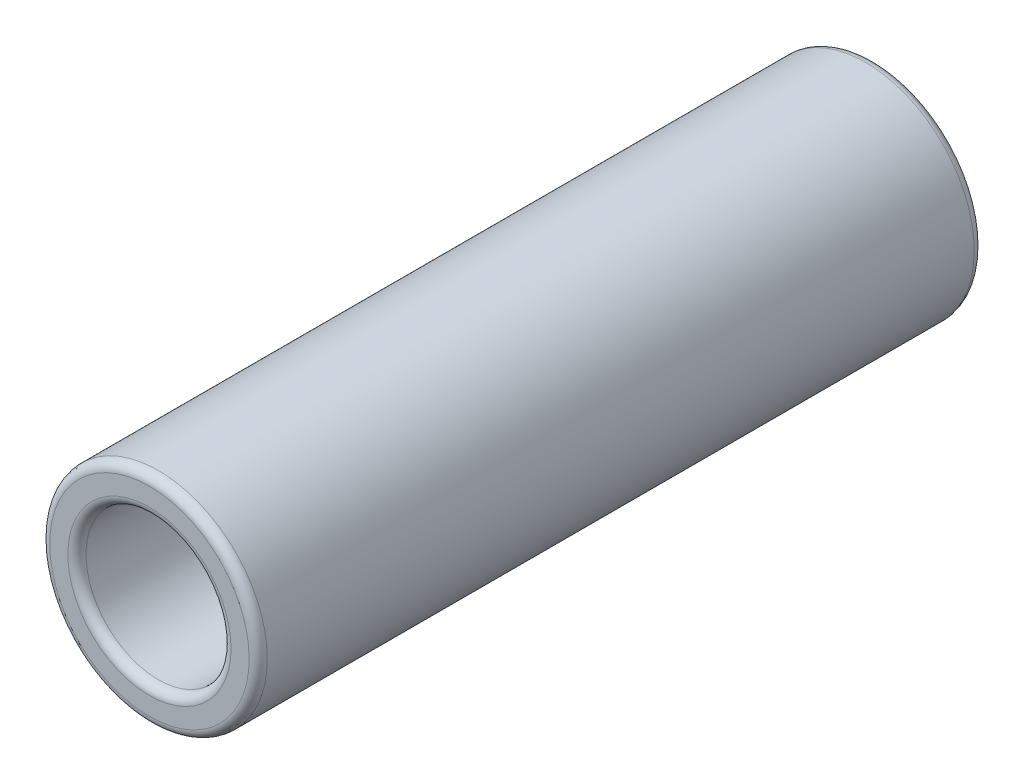
ISO-10303-21;
HEADER;
FILE_DESCRIPTION(('STEP AP214'),'2;1');
FILE_NAME('part.step','',(''),(''),'','','');
FILE_SCHEMA(('AUTOMOTIVE_DESIGN { 1 0 10303 214 1 1 1 1 }'));
ENDSEC;
DATA;
#1=APPLICATION_CONTEXT('core data for automotive mechanical design processes');
#2=APPLICATION_PROTOCOL_DEFINITION('international standard','automotive_design',2000,#1);
#3=PRODUCT_CONTEXT('',#1,'mechanical');
#4=PRODUCT('Part','Part','',(#3));
#5=PRODUCT_RELATED_PRODUCT_CATEGORY('part','',(#4));
#6=PRODUCT_DEFINITION_FORMATION('','',#4);
#7=PRODUCT_DEFINITION_CONTEXT('part definition',#1,'design');
#8=PRODUCT_DEFINITION('design','',#6,#7);
#9=PRODUCT_DEFINITION_SHAPE('','',#8);
#10=(LENGTH_UNIT() NAMED_UNIT(*) SI_UNIT(.MILLI.,.METRE.));
#11=(NAMED_UNIT(*) PLANE_ANGLE_UNIT() SI_UNIT($,.RADIAN.));
#12=(NAMED_UNIT(*) SI_UNIT($,.STERADIAN.) SOLID_ANGLE_UNIT());
#13=UNCERTAINTY_MEASURE_WITH_UNIT(LENGTH_MEASURE(1.E-05),#10,'distance_accuracy_value','');
#14=(GEOMETRIC_REPRESENTATION_CONTEXT(3) GLOBAL_UNCERTAINTY_ASSIGNED_CONTEXT((#13)) GLOBAL_UNIT_ASSIGNED_CONTEXT((#10,
#11,#12)) REPRESENTATION_CONTEXT('',''));
#15=CARTESIAN_POINT('',(0.,0.,0.));
#16=DIRECTION('',(0.,0.,1.));
#17=DIRECTION('',(1.,0.,0.));
#18=AXIS2_PLACEMENT_3D('',#15,#16,#17);
#19=CARTESIAN_POINT('',(0.,0.,20.));
#20=DIRECTION('',(0.,0.,1.));
#21=DIRECTION('',(1.,0.,0.));
#22=AXIS2_PLACEMENT_3D('',#19,#20,#21);
#23=PLANE('',#22);
#24=CARTESIAN_POINT('',(0.,0.,20.));
#25=DIRECTION('',(0.,0.,1.));
#26=DIRECTION('',(1.,0.,0.));
#27=AXIS2_PLACEMENT_3D('',#24,#25,#26);
#28=CIRCLE('',#27,4.5);
#29=CARTESIAN_POINT('',(4.5,0.,20.));
#30=VERTEX_POINT('',#29);
#31=EDGE_CURVE('E10',#30,#30,#28,.F.);
#32=ORIENTED_EDGE('',*,*,#31,.T.);
#33=EDGE_LOOP('',(#32));
#34=FACE_BOUND('',#33,.T.);
#35=CARTESIAN_POINT('',(0.,0.,20.));
#36=DIRECTION('',(0.,0.,1.));
#37=DIRECTION('',(1.,0.,0.));
#38=AXIS2_PLACEMENT_3D('',#35,#36,#37);
#39=CIRCLE('',#38,5.5);
#40=CARTESIAN_POINT('',(5.5,0.,20.));
#41=VERTEX_POINT('',#40);
#42=EDGE_CURVE('E41',#41,#41,#39,.T.);
#43=ORIENTED_EDGE('',*,*,#42,.T.);
#44=EDGE_LOOP('',(#43));
#45=FACE_BOUND('',#44,.T.);
#46=ADVANCED_FACE('F34',(#34,#45),#23,.T.);
#47=CARTESIAN_POINT('',(0.,0.,-20.));
#48=DIRECTION('',(0.,0.,1.));
#49=DIRECTION('',(1.,0.,0.));
#50=AXIS2_PLACEMENT_3D('',#47,#48,#49);
#51=PLANE('',#50);
#52=CARTESIAN_POINT('',(0.,0.,-20.));
#53=DIRECTION('',(0.,0.,1.));
#54=DIRECTION('',(1.,0.,0.));
#55=AXIS2_PLACEMENT_3D('',#52,#53,#54);
#56=CIRCLE('',#55,5.5);
#57=CARTESIAN_POINT('',(5.5,0.,-20.));
#58=VERTEX_POINT('',#57);
#59=EDGE_CURVE('E54',#58,#58,#56,.F.);
#60=ORIENTED_EDGE('',*,*,#59,.T.);
#61=EDGE_LOOP('',(#60));
#62=FACE_BOUND('',#61,.T.);
#63=CARTESIAN_POINT('',(0.,0.,-20.));
#64=DIRECTION('',(0.,0.,1.));
#65=DIRECTION('',(1.,0.,0.));
#66=AXIS2_PLACEMENT_3D('',#63,#64,#65);
#67=CIRCLE('',#66,4.5);
#68=CARTESIAN_POINT('',(4.5,0.,-20.));
#69=VERTEX_POINT('',#68);
#70=EDGE_CURVE('E57',#69,#69,#67,.T.);
#71=ORIENTED_EDGE('',*,*,#70,.T.);
#72=EDGE_LOOP('',(#71));
#73=FACE_BOUND('',#72,.T.);
#74=ADVANCED_FACE('F78',(#62,#73),#51,.F.);
#75=CARTESIAN_POINT('',(0.,0.,20.));
#76=DIRECTION('',(0.,0.,-1.));
#77=DIRECTION('',(-1.,0.,0.));
#78=AXIS2_PLACEMENT_3D('',#75,#76,#77);
#79=CYLINDRICAL_SURFACE('',#78,6.);
#80=CARTESIAN_POINT('',(0.,0.,-19.5));
#81=DIRECTION('',(0.,0.,1.));
#82=DIRECTION('',(1.,0.,0.));
#83=AXIS2_PLACEMENT_3D('',#80,#81,#82);
#84=CIRCLE('',#83,6.);
#85=CARTESIAN_POINT('',(6.,0.,-19.5));
#86=VERTEX_POINT('',#85);
#87=EDGE_CURVE('E60',#86,#86,#84,.T.);
#88=ORIENTED_EDGE('',*,*,#87,.T.);
#89=EDGE_LOOP('',(#88));
#90=FACE_BOUND('',#89,.T.);
#91=CARTESIAN_POINT('',(0.,0.,19.5));
#92=DIRECTION('',(0.,0.,1.));
#93=DIRECTION('',(1.,0.,0.));
#94=AXIS2_PLACEMENT_3D('',#91,#92,#93);
#95=CIRCLE('',#94,6.);
#96=CARTESIAN_POINT('',(6.,0.,19.5));
#97=VERTEX_POINT('',#96);
#98=EDGE_CURVE('E63',#97,#97,#95,.F.);
#99=ORIENTED_EDGE('',*,*,#98,.T.);
#100=EDGE_LOOP('',(#99));
#101=FACE_BOUND('',#100,.T.);
#102=ADVANCED_FACE('F67',(#90,#101),#79,.T.);
#103=CARTESIAN_POINT('',(0.,0.,20.));
#104=DIRECTION('',(0.,0.,-1.));
#105=DIRECTION('',(-1.,0.,0.));
#106=AXIS2_PLACEMENT_3D('',#103,#104,#105);
#107=CYLINDRICAL_SURFACE('',#106,4.);
#108=CARTESIAN_POINT('',(0.,0.,-19.5));
#109=DIRECTION('',(0.,0.,1.));
#110=DIRECTION('',(1.,0.,0.));
#111=AXIS2_PLACEMENT_3D('',#108,#109,#110);
#112=CIRCLE('',#111,4.);
#113=CARTESIAN_POINT('',(4.,0.,-19.5));
#114=VERTEX_POINT('',#113);
#115=EDGE_CURVE('E45',#114,#114,#112,.F.);
#116=ORIENTED_EDGE('',*,*,#115,.T.);
#117=EDGE_LOOP('',(#116));
#118=FACE_BOUND('',#117,.T.);
#119=CARTESIAN_POINT('',(0.,0.,19.5));
#120=DIRECTION('',(0.,0.,1.));
#121=DIRECTION('',(1.,0.,0.));
#122=AXIS2_PLACEMENT_3D('',#119,#120,#121);
#123=CIRCLE('',#122,4.);
#124=CARTESIAN_POINT('',(4.,0.,19.5));
#125=VERTEX_POINT('',#124);
#126=EDGE_CURVE('E49',#125,#125,#123,.T.);
#127=ORIENTED_EDGE('',*,*,#126,.T.);
#128=EDGE_LOOP('',(#127));
#129=FACE_BOUND('',#128,.T.);
#130=ADVANCED_FACE('F86',(#118,#129),#107,.F.);
#131=CARTESIAN_POINT('',(0.,0.,-19.5));
#132=DIRECTION('',(0.,0.,1.));
#133=DIRECTION('',(1.,0.,0.));
#134=AXIS2_PLACEMENT_3D('',#131,#132,#133);
#135=TOROIDAL_SURFACE('',#134,5.5,0.5);
#136=ORIENTED_EDGE('',*,*,#59,.F.);
#137=EDGE_LOOP('',(#136));
#138=FACE_BOUND('',#137,.T.);
#139=ORIENTED_EDGE('',*,*,#87,.F.);
#140=EDGE_LOOP('',(#139));
#141=FACE_BOUND('',#140,.T.);
#142=ADVANCED_FACE('F91',(#138,#141),#135,.T.);
#143=CARTESIAN_POINT('',(0.,0.,-19.5));
#144=DIRECTION('',(0.,0.,1.));
#145=DIRECTION('',(1.,0.,0.));
#146=AXIS2_PLACEMENT_3D('',#143,#144,#145);
#147=TOROIDAL_SURFACE('',#146,4.5,0.5);
#148=ORIENTED_EDGE('',*,*,#115,.F.);
#149=EDGE_LOOP('',(#148));
#150=FACE_BOUND('',#149,.T.);
#151=ORIENTED_EDGE('',*,*,#70,.F.);
#152=EDGE_LOOP('',(#151));
#153=FACE_BOUND('',#152,.T.);
#154=ADVANCED_FACE('F75',(#150,#153),#147,.T.);
#155=CARTESIAN_POINT('',(0.,0.,19.5));
#156=DIRECTION('',(0.,0.,1.));
#157=DIRECTION('',(1.,0.,0.));
#158=AXIS2_PLACEMENT_3D('',#155,#156,#157);
#159=TOROIDAL_SURFACE('',#158,4.5,0.5);
#160=ORIENTED_EDGE('',*,*,#31,.F.);
#161=EDGE_LOOP('',(#160));
#162=FACE_BOUND('',#161,.T.);
#163=ORIENTED_EDGE('',*,*,#126,.F.);
#164=EDGE_LOOP('',(#163));
#165=FACE_BOUND('',#164,.T.);
#166=ADVANCED_FACE('F71',(#162,#165),#159,.T.);
#167=CARTESIAN_POINT('',(0.,0.,19.5));
#168=DIRECTION('',(0.,0.,1.));
#169=DIRECTION('',(1.,0.,0.));
#170=AXIS2_PLACEMENT_3D('',#167,#168,#169);
#171=TOROIDAL_SURFACE('',#170,5.5,0.5);
#172=ORIENTED_EDGE('',*,*,#98,.F.);
#173=EDGE_LOOP('',(#172));
#174=FACE_BOUND('',#173,.T.);
#175=ORIENTED_EDGE('',*,*,#42,.F.);
#176=EDGE_LOOP('',(#175));
#177=FACE_BOUND('',#176,.T.);
#178=ADVANCED_FACE('F36',(#174,#177),#171,.T.);
#179=CLOSED_SHELL('',(#46,#74,#102,#130,#142,#154,#166,#178));
#180=MANIFOLD_SOLID_BREP('B2',#179);
#181=ADVANCED_BREP_SHAPE_REPRESENTATION('',(#18,#180),#14);
#182=SHAPE_DEFINITION_REPRESENTATION(#9,#181);
ENDSEC;
END-ISO-10303-21;
